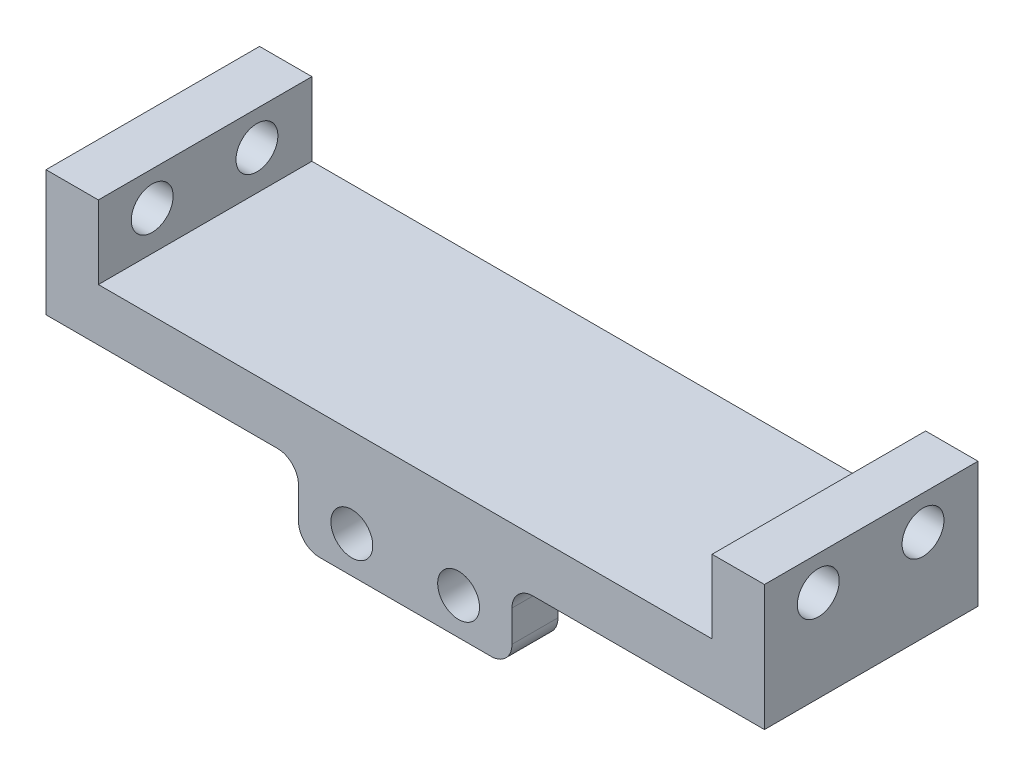
ISO-10303-21;
HEADER;
FILE_DESCRIPTION(('STEP AP214'),'2;1');
FILE_NAME('part.step','',(''),(''),'','','');
FILE_SCHEMA(('AUTOMOTIVE_DESIGN { 1 0 10303 214 1 1 1 1 }'));
ENDSEC;
DATA;
#1=APPLICATION_CONTEXT('core data for automotive mechanical design processes');
#2=APPLICATION_PROTOCOL_DEFINITION('international standard','automotive_design',2000,#1);
#3=PRODUCT_CONTEXT('',#1,'mechanical');
#4=PRODUCT('Part','Part','',(#3));
#5=PRODUCT_RELATED_PRODUCT_CATEGORY('part','',(#4));
#6=PRODUCT_DEFINITION_FORMATION('','',#4);
#7=PRODUCT_DEFINITION_CONTEXT('part definition',#1,'design');
#8=PRODUCT_DEFINITION('design','',#6,#7);
#9=PRODUCT_DEFINITION_SHAPE('','',#8);
#10=(LENGTH_UNIT() NAMED_UNIT(*) SI_UNIT(.MILLI.,.METRE.));
#11=(NAMED_UNIT(*) PLANE_ANGLE_UNIT() SI_UNIT($,.RADIAN.));
#12=(NAMED_UNIT(*) SI_UNIT($,.STERADIAN.) SOLID_ANGLE_UNIT());
#13=UNCERTAINTY_MEASURE_WITH_UNIT(LENGTH_MEASURE(1.E-05),#10,'distance_accuracy_value','');
#14=(GEOMETRIC_REPRESENTATION_CONTEXT(3) GLOBAL_UNCERTAINTY_ASSIGNED_CONTEXT((#13)) GLOBAL_UNIT_ASSIGNED_CONTEXT((#10,
#11,#12)) REPRESENTATION_CONTEXT('',''));
#15=CARTESIAN_POINT('',(0.,0.,0.));
#16=DIRECTION('',(0.,0.,1.));
#17=DIRECTION('',(1.,0.,0.));
#18=AXIS2_PLACEMENT_3D('',#15,#16,#17);
#19=CARTESIAN_POINT('',(0.,5.,0.));
#20=DIRECTION('',(1.,0.,0.));
#21=DIRECTION('',(0.,0.,-1.));
#22=AXIS2_PLACEMENT_3D('',#19,#20,#21);
#23=PLANE('',#22);
#24=CARTESIAN_POINT('',(0.,8.75,-15.13979341));
#25=DIRECTION('',(1.,0.,0.));
#26=DIRECTION('',(0.,0.,-1.));
#27=AXIS2_PLACEMENT_3D('',#24,#25,#26);
#28=CIRCLE('',#27,2.);
#29=CARTESIAN_POINT('',(0.,8.75,-17.13979341));
#30=VERTEX_POINT('',#29);
#31=EDGE_CURVE('E187',#30,#30,#28,.T.);
#32=ORIENTED_EDGE('',*,*,#31,.T.);
#33=EDGE_LOOP('',(#32));
#34=FACE_BOUND('',#33,.T.);
#35=CARTESIAN_POINT('',(0.,8.75,-5.13979341));
#36=DIRECTION('',(1.,0.,0.));
#37=DIRECTION('',(0.,0.,-1.));
#38=AXIS2_PLACEMENT_3D('',#35,#36,#37);
#39=CIRCLE('',#38,2.);
#40=CARTESIAN_POINT('',(0.,8.75,-7.13979341));
#41=VERTEX_POINT('',#40);
#42=EDGE_CURVE('E194',#41,#41,#39,.T.);
#43=ORIENTED_EDGE('',*,*,#42,.T.);
#44=EDGE_LOOP('',(#43));
#45=FACE_BOUND('',#44,.T.);
#46=DIRECTION('',(0.,0.,1.));
#47=VECTOR('',#46,1.);
#48=CARTESIAN_POINT('',(0.,0.,0.));
#49=LINE('',#48,#47);
#50=CARTESIAN_POINT('',(0.,0.,-20.38979341));
#51=VERTEX_POINT('',#50);
#52=CARTESIAN_POINT('',(0.,0.,0.));
#53=VERTEX_POINT('',#52);
#54=EDGE_CURVE('E216',#51,#53,#49,.T.);
#55=ORIENTED_EDGE('',*,*,#54,.T.);
#56=DIRECTION('',(0.,-1.,0.));
#57=VECTOR('',#56,1.);
#58=CARTESIAN_POINT('',(0.,5.,0.));
#59=LINE('',#58,#57);
#60=CARTESIAN_POINT('',(0.,12.,0.));
#61=VERTEX_POINT('',#60);
#62=EDGE_CURVE('E238',#61,#53,#59,.T.);
#63=ORIENTED_EDGE('',*,*,#62,.F.);
#64=DIRECTION('',(0.,0.,-1.));
#65=VECTOR('',#64,1.);
#66=CARTESIAN_POINT('',(0.,12.,-20.38979341));
#67=LINE('',#66,#65);
#68=CARTESIAN_POINT('',(0.,12.,-20.38979341));
#69=VERTEX_POINT('',#68);
#70=EDGE_CURVE('E190',#61,#69,#67,.T.);
#71=ORIENTED_EDGE('',*,*,#70,.T.);
#72=DIRECTION('',(0.,-1.,0.));
#73=VECTOR('',#72,1.);
#74=CARTESIAN_POINT('',(0.,5.,-20.38979341));
#75=LINE('',#74,#73);
#76=EDGE_CURVE('E221',#69,#51,#75,.T.);
#77=ORIENTED_EDGE('',*,*,#76,.T.);
#78=EDGE_LOOP('',(#55,#63,#71,#77));
#79=FACE_BOUND('',#78,.T.);
#80=ADVANCED_FACE('F39',(#34,#45,#79),#23,.F.);
#81=CARTESIAN_POINT('',(0.,5.,0.));
#82=DIRECTION('',(0.,0.,-1.));
#83=DIRECTION('',(-1.,0.,0.));
#84=AXIS2_PLACEMENT_3D('',#81,#82,#83);
#85=PLANE('',#84);
#86=CARTESIAN_POINT('',(39.3974483525,-3.49999999999999,0.));
#87=DIRECTION('',(0.,0.,1.));
#88=DIRECTION('',(1.,0.,0.));
#89=AXIS2_PLACEMENT_3D('',#86,#87,#88);
#90=CIRCLE('',#89,2.);
#91=CARTESIAN_POINT('',(41.3974483525,-3.49999999999999,0.));
#92=VERTEX_POINT('',#91);
#93=EDGE_CURVE('E246',#92,#92,#90,.T.);
#94=ORIENTED_EDGE('',*,*,#93,.F.);
#95=EDGE_LOOP('',(#94));
#96=FACE_BOUND('',#95,.T.);
#97=CARTESIAN_POINT('',(29.2025516475,-3.49999999999999,0.));
#98=DIRECTION('',(0.,0.,1.));
#99=DIRECTION('',(-1.,0.,0.));
#100=AXIS2_PLACEMENT_3D('',#97,#98,#99);
#101=CIRCLE('',#100,2.);
#102=CARTESIAN_POINT('',(27.2025516475,-3.49999999999999,0.));
#103=VERTEX_POINT('',#102);
#104=EDGE_CURVE('E374',#103,#103,#101,.T.);
#105=ORIENTED_EDGE('',*,*,#104,.F.);
#106=EDGE_LOOP('',(#105));
#107=FACE_BOUND('',#106,.T.);
#108=DIRECTION('',(0.,-1.,0.));
#109=VECTOR('',#108,1.);
#110=CARTESIAN_POINT('',(24.105103295,0.,0.));
#111=LINE('',#110,#109);
#112=CARTESIAN_POINT('',(24.105103295,-2.,0.));
#113=VERTEX_POINT('',#112);
#114=CARTESIAN_POINT('',(24.105103295,-5.,0.));
#115=VERTEX_POINT('',#114);
#116=EDGE_CURVE('E283',#113,#115,#111,.T.);
#117=ORIENTED_EDGE('',*,*,#116,.T.);
#118=CARTESIAN_POINT('',(26.105103295,-5.,0.));
#119=DIRECTION('',(0.,0.,-1.));
#120=DIRECTION('',(-1.,0.,0.));
#121=AXIS2_PLACEMENT_3D('',#118,#119,#120);
#122=CIRCLE('',#121,2.);
#123=CARTESIAN_POINT('',(26.105103295,-7.,0.));
#124=VERTEX_POINT('',#123);
#125=EDGE_CURVE('E256',#115,#124,#122,.F.);
#126=ORIENTED_EDGE('',*,*,#125,.T.);
#127=DIRECTION('',(1.,0.,0.));
#128=VECTOR('',#127,1.);
#129=CARTESIAN_POINT('',(44.494896705,-6.99999999999999,0.));
#130=LINE('',#129,#128);
#131=CARTESIAN_POINT('',(42.494896705,-6.99999999999999,0.));
#132=VERTEX_POINT('',#131);
#133=EDGE_CURVE('E292',#124,#132,#130,.T.);
#134=ORIENTED_EDGE('',*,*,#133,.T.);
#135=CARTESIAN_POINT('',(42.494896705,-4.99999999999999,0.));
#136=DIRECTION('',(0.,0.,-1.));
#137=DIRECTION('',(-1.,0.,0.));
#138=AXIS2_PLACEMENT_3D('',#135,#136,#137);
#139=CIRCLE('',#138,2.);
#140=CARTESIAN_POINT('',(44.494896705,-4.99999999999999,0.));
#141=VERTEX_POINT('',#140);
#142=EDGE_CURVE('E254',#132,#141,#139,.F.);
#143=ORIENTED_EDGE('',*,*,#142,.T.);
#144=DIRECTION('',(0.,1.,0.));
#145=VECTOR('',#144,1.);
#146=CARTESIAN_POINT('',(44.494896705,0.,0.));
#147=LINE('',#146,#145);
#148=CARTESIAN_POINT('',(44.494896705,-2.,0.));
#149=VERTEX_POINT('',#148);
#150=EDGE_CURVE('E249',#141,#149,#147,.T.);
#151=ORIENTED_EDGE('',*,*,#150,.T.);
#152=CARTESIAN_POINT('',(46.494896705,-2.,0.));
#153=DIRECTION('',(0.,0.,-1.));
#154=DIRECTION('',(-1.,0.,0.));
#155=AXIS2_PLACEMENT_3D('',#152,#153,#154);
#156=CIRCLE('',#155,2.);
#157=CARTESIAN_POINT('',(46.494896705,0.,0.));
#158=VERTEX_POINT('',#157);
#159=EDGE_CURVE('E276',#149,#158,#156,.T.);
#160=ORIENTED_EDGE('',*,*,#159,.T.);
#161=DIRECTION('',(1.,0.,0.));
#162=VECTOR('',#161,1.);
#163=CARTESIAN_POINT('',(0.,0.,0.));
#164=LINE('',#163,#162);
#165=CARTESIAN_POINT('',(68.6,0.,0.));
#166=VERTEX_POINT('',#165);
#167=EDGE_CURVE('E224',#158,#166,#164,.T.);
#168=ORIENTED_EDGE('',*,*,#167,.T.);
#169=DIRECTION('',(0.,-1.,0.));
#170=VECTOR('',#169,1.);
#171=CARTESIAN_POINT('',(68.6,5.,0.));
#172=LINE('',#171,#170);
#173=CARTESIAN_POINT('',(68.6,12.,0.));
#174=VERTEX_POINT('',#173);
#175=EDGE_CURVE('E235',#174,#166,#172,.T.);
#176=ORIENTED_EDGE('',*,*,#175,.F.);
#177=DIRECTION('',(1.,0.,0.));
#178=VECTOR('',#177,1.);
#179=CARTESIAN_POINT('',(63.6,12.,0.));
#180=LINE('',#179,#178);
#181=CARTESIAN_POINT('',(63.6,12.,0.));
#182=VERTEX_POINT('',#181);
#183=EDGE_CURVE('E169',#182,#174,#180,.T.);
#184=ORIENTED_EDGE('',*,*,#183,.F.);
#185=DIRECTION('',(0.,1.,0.));
#186=VECTOR('',#185,1.);
#187=CARTESIAN_POINT('',(63.6,0.,0.));
#188=LINE('',#187,#186);
#189=CARTESIAN_POINT('',(63.6,5.,0.));
#190=VERTEX_POINT('',#189);
#191=EDGE_CURVE('E156',#190,#182,#188,.T.);
#192=ORIENTED_EDGE('',*,*,#191,.F.);
#193=DIRECTION('',(1.,0.,0.));
#194=VECTOR('',#193,1.);
#195=CARTESIAN_POINT('',(0.,5.,0.));
#196=LINE('',#195,#194);
#197=CARTESIAN_POINT('',(5.,5.,0.));
#198=VERTEX_POINT('',#197);
#199=EDGE_CURVE('E217',#198,#190,#196,.T.);
#200=ORIENTED_EDGE('',*,*,#199,.F.);
#201=DIRECTION('',(0.,1.,0.));
#202=VECTOR('',#201,1.);
#203=CARTESIAN_POINT('',(5.,0.,0.));
#204=LINE('',#203,#202);
#205=CARTESIAN_POINT('',(5.,12.,0.));
#206=VERTEX_POINT('',#205);
#207=EDGE_CURVE('E201',#198,#206,#204,.T.);
#208=ORIENTED_EDGE('',*,*,#207,.T.);
#209=DIRECTION('',(-1.,0.,0.));
#210=VECTOR('',#209,1.);
#211=CARTESIAN_POINT('',(5.,12.,0.));
#212=LINE('',#211,#210);
#213=EDGE_CURVE('E206',#206,#61,#212,.T.);
#214=ORIENTED_EDGE('',*,*,#213,.T.);
#215=ORIENTED_EDGE('',*,*,#62,.T.);
#216=CARTESIAN_POINT('',(22.105103295,0.,0.));
#217=VERTEX_POINT('',#216);
#218=EDGE_CURVE('E225',#53,#217,#164,.T.);
#219=ORIENTED_EDGE('',*,*,#218,.T.);
#220=CARTESIAN_POINT('',(22.105103295,-2.,0.));
#221=DIRECTION('',(0.,0.,-1.));
#222=DIRECTION('',(-1.,0.,0.));
#223=AXIS2_PLACEMENT_3D('',#220,#221,#222);
#224=CIRCLE('',#223,2.);
#225=EDGE_CURVE('E47',#217,#113,#224,.T.);
#226=ORIENTED_EDGE('',*,*,#225,.T.);
#227=EDGE_LOOP('',(#117,#126,#134,#143,#151,#160,#168,#176,#184,#192,#200,#208,#214,#215,#219,#226));
#228=FACE_BOUND('',#227,.T.);
#229=ADVANCED_FACE('F282',(#96,#107,#228),#85,.F.);
#230=CARTESIAN_POINT('',(68.6,5.,0.));
#231=DIRECTION('',(-1.,0.,0.));
#232=DIRECTION('',(0.,0.,1.));
#233=AXIS2_PLACEMENT_3D('',#230,#231,#232);
#234=PLANE('',#233);
#235=CARTESIAN_POINT('',(68.6,8.75,-15.13979341));
#236=DIRECTION('',(1.,0.,0.));
#237=DIRECTION('',(0.,0.,-1.));
#238=AXIS2_PLACEMENT_3D('',#235,#236,#237);
#239=CIRCLE('',#238,2.);
#240=CARTESIAN_POINT('',(68.6,8.75,-17.13979341));
#241=VERTEX_POINT('',#240);
#242=EDGE_CURVE('E176',#241,#241,#239,.T.);
#243=ORIENTED_EDGE('',*,*,#242,.F.);
#244=EDGE_LOOP('',(#243));
#245=FACE_BOUND('',#244,.T.);
#246=CARTESIAN_POINT('',(68.6,8.75,-5.13979341));
#247=DIRECTION('',(1.,0.,0.));
#248=DIRECTION('',(0.,0.,-1.));
#249=AXIS2_PLACEMENT_3D('',#246,#247,#248);
#250=CIRCLE('',#249,2.);
#251=CARTESIAN_POINT('',(68.6,8.75,-7.13979341));
#252=VERTEX_POINT('',#251);
#253=EDGE_CURVE('E315',#252,#252,#250,.T.);
#254=ORIENTED_EDGE('',*,*,#253,.F.);
#255=EDGE_LOOP('',(#254));
#256=FACE_BOUND('',#255,.T.);
#257=DIRECTION('',(0.,0.,-1.));
#258=VECTOR('',#257,1.);
#259=CARTESIAN_POINT('',(68.6,0.,0.));
#260=LINE('',#259,#258);
#261=CARTESIAN_POINT('',(68.6,0.,-20.38979341));
#262=VERTEX_POINT('',#261);
#263=EDGE_CURVE('E228',#166,#262,#260,.T.);
#264=ORIENTED_EDGE('',*,*,#263,.T.);
#265=DIRECTION('',(0.,-1.,0.));
#266=VECTOR('',#265,1.);
#267=CARTESIAN_POINT('',(68.6,5.,-20.38979341));
#268=LINE('',#267,#266);
#269=CARTESIAN_POINT('',(68.6,12.,-20.38979341));
#270=VERTEX_POINT('',#269);
#271=EDGE_CURVE('E233',#270,#262,#268,.T.);
#272=ORIENTED_EDGE('',*,*,#271,.F.);
#273=DIRECTION('',(0.,0.,-1.));
#274=VECTOR('',#273,1.);
#275=CARTESIAN_POINT('',(68.6,12.,-20.38979341));
#276=LINE('',#275,#274);
#277=EDGE_CURVE('E166',#174,#270,#276,.T.);
#278=ORIENTED_EDGE('',*,*,#277,.F.);
#279=ORIENTED_EDGE('',*,*,#175,.T.);
#280=EDGE_LOOP('',(#264,#272,#278,#279));
#281=FACE_BOUND('',#280,.T.);
#282=ADVANCED_FACE('F344',(#245,#256,#281),#234,.F.);
#283=CARTESIAN_POINT('',(0.,5.,-20.38979341));
#284=DIRECTION('',(0.,0.,1.));
#285=DIRECTION('',(1.,0.,0.));
#286=AXIS2_PLACEMENT_3D('',#283,#284,#285);
#287=PLANE('',#286);
#288=DIRECTION('',(-1.,0.,0.));
#289=VECTOR('',#288,1.);
#290=CARTESIAN_POINT('',(0.,5.,-20.38979341));
#291=LINE('',#290,#289);
#292=CARTESIAN_POINT('',(63.6,5.,-20.38979341));
#293=VERTEX_POINT('',#292);
#294=CARTESIAN_POINT('',(5.,5.,-20.38979341));
#295=VERTEX_POINT('',#294);
#296=EDGE_CURVE('E174',#293,#295,#291,.T.);
#297=ORIENTED_EDGE('',*,*,#296,.F.);
#298=DIRECTION('',(0.,-1.,0.));
#299=VECTOR('',#298,1.);
#300=CARTESIAN_POINT('',(63.6,0.,-20.38979341));
#301=LINE('',#300,#299);
#302=CARTESIAN_POINT('',(63.6,12.,-20.38979341));
#303=VERTEX_POINT('',#302);
#304=EDGE_CURVE('E154',#303,#293,#301,.T.);
#305=ORIENTED_EDGE('',*,*,#304,.F.);
#306=DIRECTION('',(1.,0.,0.));
#307=VECTOR('',#306,1.);
#308=CARTESIAN_POINT('',(63.6,12.,-20.38979341));
#309=LINE('',#308,#307);
#310=EDGE_CURVE('E163',#303,#270,#309,.T.);
#311=ORIENTED_EDGE('',*,*,#310,.T.);
#312=ORIENTED_EDGE('',*,*,#271,.T.);
#313=DIRECTION('',(-1.,0.,0.));
#314=VECTOR('',#313,1.);
#315=CARTESIAN_POINT('',(0.,0.,-20.38979341));
#316=LINE('',#315,#314);
#317=EDGE_CURVE('E219',#262,#51,#316,.T.);
#318=ORIENTED_EDGE('',*,*,#317,.T.);
#319=ORIENTED_EDGE('',*,*,#76,.F.);
#320=DIRECTION('',(-1.,0.,0.));
#321=VECTOR('',#320,1.);
#322=CARTESIAN_POINT('',(5.,12.,-20.38979341));
#323=LINE('',#322,#321);
#324=CARTESIAN_POINT('',(5.,12.,-20.38979341));
#325=VERTEX_POINT('',#324);
#326=EDGE_CURVE('E209',#325,#69,#323,.T.);
#327=ORIENTED_EDGE('',*,*,#326,.F.);
#328=DIRECTION('',(0.,-1.,0.));
#329=VECTOR('',#328,1.);
#330=CARTESIAN_POINT('',(5.,0.,-20.38979341));
#331=LINE('',#330,#329);
#332=EDGE_CURVE('E199',#325,#295,#331,.T.);
#333=ORIENTED_EDGE('',*,*,#332,.T.);
#334=EDGE_LOOP('',(#297,#305,#311,#312,#318,#319,#327,#333));
#335=FACE_BOUND('',#334,.T.);
#336=ADVANCED_FACE('F172',(#335),#287,.F.);
#337=CARTESIAN_POINT('',(0.,5.,0.));
#338=DIRECTION('',(0.,-1.,0.));
#339=DIRECTION('',(0.,0.,-1.));
#340=AXIS2_PLACEMENT_3D('',#337,#338,#339);
#341=PLANE('',#340);
#342=ORIENTED_EDGE('',*,*,#199,.T.);
#343=DIRECTION('',(0.,0.,-1.));
#344=VECTOR('',#343,1.);
#345=CARTESIAN_POINT('',(63.6,5.,0.));
#346=LINE('',#345,#344);
#347=EDGE_CURVE('E183',#190,#293,#346,.T.);
#348=ORIENTED_EDGE('',*,*,#347,.T.);
#349=ORIENTED_EDGE('',*,*,#296,.T.);
#350=DIRECTION('',(0.,0.,1.));
#351=VECTOR('',#350,1.);
#352=CARTESIAN_POINT('',(5.,5.,0.));
#353=LINE('',#352,#351);
#354=EDGE_CURVE('E212',#295,#198,#353,.T.);
#355=ORIENTED_EDGE('',*,*,#354,.T.);
#356=EDGE_LOOP('',(#342,#348,#349,#355));
#357=FACE_BOUND('',#356,.T.);
#358=ADVANCED_FACE('F464',(#357),#341,.F.);
#359=CARTESIAN_POINT('',(0.,0.,0.));
#360=DIRECTION('',(0.,-1.,0.));
#361=DIRECTION('',(0.,0.,-1.));
#362=AXIS2_PLACEMENT_3D('',#359,#360,#361);
#363=PLANE('',#362);
#364=ORIENTED_EDGE('',*,*,#167,.F.);
#365=DIRECTION('',(0.,0.,1.));
#366=VECTOR('',#365,1.);
#367=CARTESIAN_POINT('',(46.494896705,0.,-4.38979341));
#368=LINE('',#367,#366);
#369=CARTESIAN_POINT('',(46.494896705,0.,-4.38979341));
#370=VERTEX_POINT('',#369);
#371=EDGE_CURVE('E274',#158,#370,#368,.F.);
#372=ORIENTED_EDGE('',*,*,#371,.T.);
#373=DIRECTION('',(-1.,0.,0.));
#374=VECTOR('',#373,1.);
#375=CARTESIAN_POINT('',(44.494896705,0.,-4.38979341));
#376=LINE('',#375,#374);
#377=CARTESIAN_POINT('',(22.105103295,0.,-4.38979341));
#378=VERTEX_POINT('',#377);
#379=EDGE_CURVE('E53',#370,#378,#376,.T.);
#380=ORIENTED_EDGE('',*,*,#379,.T.);
#381=DIRECTION('',(0.,0.,1.));
#382=VECTOR('',#381,1.);
#383=CARTESIAN_POINT('',(22.105103295,0.,0.));
#384=LINE('',#383,#382);
#385=EDGE_CURVE('E272',#378,#217,#384,.T.);
#386=ORIENTED_EDGE('',*,*,#385,.T.);
#387=ORIENTED_EDGE('',*,*,#218,.F.);
#388=ORIENTED_EDGE('',*,*,#54,.F.);
#389=ORIENTED_EDGE('',*,*,#317,.F.);
#390=ORIENTED_EDGE('',*,*,#263,.F.);
#391=EDGE_LOOP('',(#364,#372,#380,#386,#387,#388,#389,#390));
#392=FACE_BOUND('',#391,.T.);
#393=ADVANCED_FACE('F461',(#392),#363,.T.);
#394=CARTESIAN_POINT('',(5.,0.,0.));
#395=DIRECTION('',(1.,0.,0.));
#396=DIRECTION('',(0.,0.,-1.));
#397=AXIS2_PLACEMENT_3D('',#394,#395,#396);
#398=PLANE('',#397);
#399=CARTESIAN_POINT('',(5.,8.75,-15.13979341));
#400=DIRECTION('',(1.,0.,0.));
#401=DIRECTION('',(0.,0.,-1.));
#402=AXIS2_PLACEMENT_3D('',#399,#400,#401);
#403=CIRCLE('',#402,2.);
#404=CARTESIAN_POINT('',(5.,8.75,-17.13979341));
#405=VERTEX_POINT('',#404);
#406=EDGE_CURVE('E191',#405,#405,#403,.T.);
#407=ORIENTED_EDGE('',*,*,#406,.F.);
#408=EDGE_LOOP('',(#407));
#409=FACE_BOUND('',#408,.T.);
#410=CARTESIAN_POINT('',(5.,8.75,-5.13979341));
#411=DIRECTION('',(1.,0.,0.));
#412=DIRECTION('',(0.,0.,-1.));
#413=AXIS2_PLACEMENT_3D('',#410,#411,#412);
#414=CIRCLE('',#413,2.);
#415=CARTESIAN_POINT('',(5.,8.75,-7.13979341));
#416=VERTEX_POINT('',#415);
#417=EDGE_CURVE('E186',#416,#416,#414,.T.);
#418=ORIENTED_EDGE('',*,*,#417,.F.);
#419=EDGE_LOOP('',(#418));
#420=FACE_BOUND('',#419,.T.);
#421=ORIENTED_EDGE('',*,*,#354,.F.);
#422=ORIENTED_EDGE('',*,*,#332,.F.);
#423=DIRECTION('',(0.,0.,-1.));
#424=VECTOR('',#423,1.);
#425=CARTESIAN_POINT('',(5.,12.,-20.38979341));
#426=LINE('',#425,#424);
#427=EDGE_CURVE('E203',#206,#325,#426,.T.);
#428=ORIENTED_EDGE('',*,*,#427,.F.);
#429=ORIENTED_EDGE('',*,*,#207,.F.);
#430=EDGE_LOOP('',(#421,#422,#428,#429));
#431=FACE_BOUND('',#430,.T.);
#432=ADVANCED_FACE('F463',(#409,#420,#431),#398,.T.);
#433=CARTESIAN_POINT('',(5.,12.,-20.38979341));
#434=DIRECTION('',(0.,1.,0.));
#435=DIRECTION('',(0.,0.,1.));
#436=AXIS2_PLACEMENT_3D('',#433,#434,#435);
#437=PLANE('',#436);
#438=ORIENTED_EDGE('',*,*,#70,.F.);
#439=ORIENTED_EDGE('',*,*,#213,.F.);
#440=ORIENTED_EDGE('',*,*,#427,.T.);
#441=ORIENTED_EDGE('',*,*,#326,.T.);
#442=EDGE_LOOP('',(#438,#439,#440,#441));
#443=FACE_BOUND('',#442,.T.);
#444=ADVANCED_FACE('F528',(#443),#437,.T.);
#445=CARTESIAN_POINT('',(0.,8.75,-5.13979341));
#446=DIRECTION('',(1.,0.,0.));
#447=DIRECTION('',(0.,0.,-1.));
#448=AXIS2_PLACEMENT_3D('',#445,#446,#447);
#449=CYLINDRICAL_SURFACE('',#448,2.);
#450=ORIENTED_EDGE('',*,*,#42,.F.);
#451=EDGE_LOOP('',(#450));
#452=FACE_BOUND('',#451,.T.);
#453=ORIENTED_EDGE('',*,*,#417,.T.);
#454=EDGE_LOOP('',(#453));
#455=FACE_BOUND('',#454,.T.);
#456=ADVANCED_FACE('F520',(#452,#455),#449,.F.);
#457=CARTESIAN_POINT('',(0.,8.75,-15.13979341));
#458=DIRECTION('',(1.,0.,0.));
#459=DIRECTION('',(0.,0.,-1.));
#460=AXIS2_PLACEMENT_3D('',#457,#458,#459);
#461=CYLINDRICAL_SURFACE('',#460,2.);
#462=ORIENTED_EDGE('',*,*,#31,.F.);
#463=EDGE_LOOP('',(#462));
#464=FACE_BOUND('',#463,.T.);
#465=ORIENTED_EDGE('',*,*,#406,.T.);
#466=EDGE_LOOP('',(#465));
#467=FACE_BOUND('',#466,.T.);
#468=ADVANCED_FACE('F491',(#464,#467),#461,.F.);
#469=CARTESIAN_POINT('',(63.6,0.,0.));
#470=DIRECTION('',(-1.,0.,0.));
#471=DIRECTION('',(0.,0.,-1.));
#472=AXIS2_PLACEMENT_3D('',#469,#470,#471);
#473=PLANE('',#472);
#474=CARTESIAN_POINT('',(63.6,8.75,-15.13979341));
#475=DIRECTION('',(1.,0.,0.));
#476=DIRECTION('',(0.,0.,-1.));
#477=AXIS2_PLACEMENT_3D('',#474,#475,#476);
#478=CIRCLE('',#477,2.);
#479=CARTESIAN_POINT('',(63.6,8.75,-17.13979341));
#480=VERTEX_POINT('',#479);
#481=EDGE_CURVE('E313',#480,#480,#478,.T.);
#482=ORIENTED_EDGE('',*,*,#481,.T.);
#483=EDGE_LOOP('',(#482));
#484=FACE_BOUND('',#483,.T.);
#485=CARTESIAN_POINT('',(63.6,8.75,-5.13979341));
#486=DIRECTION('',(1.,0.,0.));
#487=DIRECTION('',(0.,0.,-1.));
#488=AXIS2_PLACEMENT_3D('',#485,#486,#487);
#489=CIRCLE('',#488,2.);
#490=CARTESIAN_POINT('',(63.6,8.75,-7.13979341));
#491=VERTEX_POINT('',#490);
#492=EDGE_CURVE('E179',#491,#491,#489,.T.);
#493=ORIENTED_EDGE('',*,*,#492,.T.);
#494=EDGE_LOOP('',(#493));
#495=FACE_BOUND('',#494,.T.);
#496=ORIENTED_EDGE('',*,*,#347,.F.);
#497=ORIENTED_EDGE('',*,*,#191,.T.);
#498=DIRECTION('',(0.,0.,-1.));
#499=VECTOR('',#498,1.);
#500=CARTESIAN_POINT('',(63.6,12.,-20.38979341));
#501=LINE('',#500,#499);
#502=EDGE_CURVE('E149',#182,#303,#501,.T.);
#503=ORIENTED_EDGE('',*,*,#502,.T.);
#504=ORIENTED_EDGE('',*,*,#304,.T.);
#505=EDGE_LOOP('',(#496,#497,#503,#504));
#506=FACE_BOUND('',#505,.T.);
#507=ADVANCED_FACE('F152',(#484,#495,#506),#473,.T.);
#508=CARTESIAN_POINT('',(63.6,12.,-20.38979341));
#509=DIRECTION('',(0.,-1.,0.));
#510=DIRECTION('',(0.,0.,-1.));
#511=AXIS2_PLACEMENT_3D('',#508,#509,#510);
#512=PLANE('',#511);
#513=ORIENTED_EDGE('',*,*,#277,.T.);
#514=ORIENTED_EDGE('',*,*,#310,.F.);
#515=ORIENTED_EDGE('',*,*,#502,.F.);
#516=ORIENTED_EDGE('',*,*,#183,.T.);
#517=EDGE_LOOP('',(#513,#514,#515,#516));
#518=FACE_BOUND('',#517,.T.);
#519=ADVANCED_FACE('F164',(#518),#512,.F.);
#520=CARTESIAN_POINT('',(68.6,8.75,-5.13979341));
#521=DIRECTION('',(-1.,0.,0.));
#522=DIRECTION('',(0.,0.,1.));
#523=AXIS2_PLACEMENT_3D('',#520,#521,#522);
#524=CYLINDRICAL_SURFACE('',#523,2.);
#525=ORIENTED_EDGE('',*,*,#253,.T.);
#526=EDGE_LOOP('',(#525));
#527=FACE_BOUND('',#526,.T.);
#528=ORIENTED_EDGE('',*,*,#492,.F.);
#529=EDGE_LOOP('',(#528));
#530=FACE_BOUND('',#529,.T.);
#531=ADVANCED_FACE('F323',(#527,#530),#524,.F.);
#532=CARTESIAN_POINT('',(68.6,8.75,-15.13979341));
#533=DIRECTION('',(-1.,0.,0.));
#534=DIRECTION('',(0.,0.,1.));
#535=AXIS2_PLACEMENT_3D('',#532,#533,#534);
#536=CYLINDRICAL_SURFACE('',#535,2.);
#537=ORIENTED_EDGE('',*,*,#242,.T.);
#538=EDGE_LOOP('',(#537));
#539=FACE_BOUND('',#538,.T.);
#540=ORIENTED_EDGE('',*,*,#481,.F.);
#541=EDGE_LOOP('',(#540));
#542=FACE_BOUND('',#541,.T.);
#543=ADVANCED_FACE('F325',(#539,#542),#536,.F.);
#544=CARTESIAN_POINT('',(44.494896705,0.,-4.38979341));
#545=DIRECTION('',(1.,0.,0.));
#546=DIRECTION('',(0.,0.,-1.));
#547=AXIS2_PLACEMENT_3D('',#544,#545,#546);
#548=PLANE('',#547);
#549=ORIENTED_EDGE('',*,*,#150,.F.);
#550=DIRECTION('',(0.,0.,1.));
#551=VECTOR('',#550,1.);
#552=CARTESIAN_POINT('',(44.494896705,-4.99999999999999,-4.38979341));
#553=LINE('',#552,#551);
#554=CARTESIAN_POINT('',(44.494896705,-4.99999999999999,-4.38979341));
#555=VERTEX_POINT('',#554);
#556=EDGE_CURVE('E270',#141,#555,#553,.F.);
#557=ORIENTED_EDGE('',*,*,#556,.T.);
#558=DIRECTION('',(0.,1.,0.));
#559=VECTOR('',#558,1.);
#560=CARTESIAN_POINT('',(44.494896705,0.,-4.38979341));
#561=LINE('',#560,#559);
#562=CARTESIAN_POINT('',(44.494896705,-2.,-4.38979341));
#563=VERTEX_POINT('',#562);
#564=EDGE_CURVE('E303',#555,#563,#561,.T.);
#565=ORIENTED_EDGE('',*,*,#564,.T.);
#566=DIRECTION('',(0.,0.,1.));
#567=VECTOR('',#566,1.);
#568=CARTESIAN_POINT('',(44.494896705,-2.,0.));
#569=LINE('',#568,#567);
#570=EDGE_CURVE('E267',#563,#149,#569,.T.);
#571=ORIENTED_EDGE('',*,*,#570,.T.);
#572=EDGE_LOOP('',(#549,#557,#565,#571));
#573=FACE_BOUND('',#572,.T.);
#574=ADVANCED_FACE('F331',(#573),#548,.T.);
#575=CARTESIAN_POINT('',(44.494896705,-6.99999999999999,-4.38979341));
#576=DIRECTION('',(0.,-1.,0.));
#577=DIRECTION('',(1.,0.,0.));
#578=AXIS2_PLACEMENT_3D('',#575,#576,#577);
#579=PLANE('',#578);
#580=ORIENTED_EDGE('',*,*,#133,.F.);
#581=DIRECTION('',(0.,0.,1.));
#582=VECTOR('',#581,1.);
#583=CARTESIAN_POINT('',(26.105103295,-7.,-4.38979341));
#584=LINE('',#583,#582);
#585=CARTESIAN_POINT('',(26.105103295,-7.,-4.38979341));
#586=VERTEX_POINT('',#585);
#587=EDGE_CURVE('E261',#124,#586,#584,.F.);
#588=ORIENTED_EDGE('',*,*,#587,.T.);
#589=DIRECTION('',(1.,0.,0.));
#590=VECTOR('',#589,1.);
#591=CARTESIAN_POINT('',(44.494896705,-6.99999999999999,-4.38979341));
#592=LINE('',#591,#590);
#593=CARTESIAN_POINT('',(42.494896705,-6.99999999999999,-4.38979341));
#594=VERTEX_POINT('',#593);
#595=EDGE_CURVE('E299',#586,#594,#592,.T.);
#596=ORIENTED_EDGE('',*,*,#595,.T.);
#597=DIRECTION('',(0.,0.,1.));
#598=VECTOR('',#597,1.);
#599=CARTESIAN_POINT('',(42.494896705,-6.99999999999999,-4.38979341));
#600=LINE('',#599,#598);
#601=EDGE_CURVE('E258',#594,#132,#600,.T.);
#602=ORIENTED_EDGE('',*,*,#601,.T.);
#603=EDGE_LOOP('',(#580,#588,#596,#602));
#604=FACE_BOUND('',#603,.T.);
#605=ADVANCED_FACE('F396',(#604),#579,.T.);
#606=CARTESIAN_POINT('',(24.105103295,0.,-4.38979341));
#607=DIRECTION('',(-1.,0.,0.));
#608=DIRECTION('',(0.,-1.,0.));
#609=AXIS2_PLACEMENT_3D('',#606,#607,#608);
#610=PLANE('',#609);
#611=DIRECTION('',(0.,-1.,0.));
#612=VECTOR('',#611,1.);
#613=CARTESIAN_POINT('',(24.105103295,0.,-4.38979341));
#614=LINE('',#613,#612);
#615=CARTESIAN_POINT('',(24.105103295,-2.,-4.38979341));
#616=VERTEX_POINT('',#615);
#617=CARTESIAN_POINT('',(24.105103295,-5.,-4.38979341));
#618=VERTEX_POINT('',#617);
#619=EDGE_CURVE('E297',#616,#618,#614,.T.);
#620=ORIENTED_EDGE('',*,*,#619,.T.);
#621=DIRECTION('',(0.,0.,1.));
#622=VECTOR('',#621,1.);
#623=CARTESIAN_POINT('',(24.105103295,-5.,-4.38979341));
#624=LINE('',#623,#622);
#625=EDGE_CURVE('E251',#618,#115,#624,.T.);
#626=ORIENTED_EDGE('',*,*,#625,.T.);
#627=ORIENTED_EDGE('',*,*,#116,.F.);
#628=DIRECTION('',(0.,0.,1.));
#629=VECTOR('',#628,1.);
#630=CARTESIAN_POINT('',(24.105103295,-2.,-4.38979341));
#631=LINE('',#630,#629);
#632=EDGE_CURVE('E241',#113,#616,#631,.F.);
#633=ORIENTED_EDGE('',*,*,#632,.T.);
#634=EDGE_LOOP('',(#620,#626,#627,#633));
#635=FACE_BOUND('',#634,.T.);
#636=ADVANCED_FACE('F289',(#635),#610,.T.);
#637=CARTESIAN_POINT('',(0.,0.,-4.38979341));
#638=DIRECTION('',(0.,0.,-1.));
#639=DIRECTION('',(-1.,0.,0.));
#640=AXIS2_PLACEMENT_3D('',#637,#638,#639);
#641=PLANE('',#640);
#642=CARTESIAN_POINT('',(39.3974483525,-3.49999999999999,-4.38979341));
#643=DIRECTION('',(0.,0.,-1.));
#644=DIRECTION('',(-1.,0.,0.));
#645=AXIS2_PLACEMENT_3D('',#642,#643,#644);
#646=CIRCLE('',#645,2.);
#647=CARTESIAN_POINT('',(37.3974483525,-3.49999999999999,-4.38979341));
#648=VERTEX_POINT('',#647);
#649=EDGE_CURVE('E245',#648,#648,#646,.T.);
#650=ORIENTED_EDGE('',*,*,#649,.F.);
#651=EDGE_LOOP('',(#650));
#652=FACE_BOUND('',#651,.T.);
#653=CARTESIAN_POINT('',(29.2025516475,-3.49999999999999,-4.38979341));
#654=DIRECTION('',(0.,0.,-1.));
#655=DIRECTION('',(-1.,0.,0.));
#656=AXIS2_PLACEMENT_3D('',#653,#654,#655);
#657=CIRCLE('',#656,2.);
#658=CARTESIAN_POINT('',(27.2025516475,-3.49999999999999,-4.38979341));
#659=VERTEX_POINT('',#658);
#660=EDGE_CURVE('E242',#659,#659,#657,.T.);
#661=ORIENTED_EDGE('',*,*,#660,.F.);
#662=EDGE_LOOP('',(#661));
#663=FACE_BOUND('',#662,.T.);
#664=ORIENTED_EDGE('',*,*,#595,.F.);
#665=CARTESIAN_POINT('',(26.105103295,-5.,-4.38979341));
#666=DIRECTION('',(0.,0.,-1.));
#667=DIRECTION('',(-1.,0.,0.));
#668=AXIS2_PLACEMENT_3D('',#665,#666,#667);
#669=CIRCLE('',#668,2.);
#670=EDGE_CURVE('E265',#586,#618,#669,.T.);
#671=ORIENTED_EDGE('',*,*,#670,.T.);
#672=ORIENTED_EDGE('',*,*,#619,.F.);
#673=CARTESIAN_POINT('',(22.105103295,-2.,-4.38979341));
#674=DIRECTION('',(0.,0.,-1.));
#675=DIRECTION('',(-1.,0.,0.));
#676=AXIS2_PLACEMENT_3D('',#673,#674,#675);
#677=CIRCLE('',#676,2.);
#678=EDGE_CURVE('E11',#616,#378,#677,.F.);
#679=ORIENTED_EDGE('',*,*,#678,.T.);
#680=ORIENTED_EDGE('',*,*,#379,.F.);
#681=CARTESIAN_POINT('',(46.494896705,-2.,-4.38979341));
#682=DIRECTION('',(0.,0.,-1.));
#683=DIRECTION('',(-1.,0.,0.));
#684=AXIS2_PLACEMENT_3D('',#681,#682,#683);
#685=CIRCLE('',#684,2.);
#686=EDGE_CURVE('E278',#370,#563,#685,.F.);
#687=ORIENTED_EDGE('',*,*,#686,.T.);
#688=ORIENTED_EDGE('',*,*,#564,.F.);
#689=CARTESIAN_POINT('',(42.494896705,-4.99999999999999,-4.38979341));
#690=DIRECTION('',(0.,0.,-1.));
#691=DIRECTION('',(-1.,0.,0.));
#692=AXIS2_PLACEMENT_3D('',#689,#690,#691);
#693=CIRCLE('',#692,2.);
#694=EDGE_CURVE('E263',#555,#594,#693,.T.);
#695=ORIENTED_EDGE('',*,*,#694,.T.);
#696=EDGE_LOOP('',(#664,#671,#672,#679,#680,#687,#688,#695));
#697=FACE_BOUND('',#696,.T.);
#698=ADVANCED_FACE('F296',(#652,#663,#697),#641,.T.);
#699=CARTESIAN_POINT('',(29.2025516475,-3.49999999999999,-5.));
#700=DIRECTION('',(0.,0.,1.));
#701=DIRECTION('',(1.,0.,0.));
#702=AXIS2_PLACEMENT_3D('',#699,#700,#701);
#703=CYLINDRICAL_SURFACE('',#702,2.);
#704=ORIENTED_EDGE('',*,*,#660,.T.);
#705=EDGE_LOOP('',(#704));
#706=FACE_BOUND('',#705,.T.);
#707=ORIENTED_EDGE('',*,*,#104,.T.);
#708=EDGE_LOOP('',(#707));
#709=FACE_BOUND('',#708,.T.);
#710=ADVANCED_FACE('F383',(#706,#709),#703,.F.);
#711=CARTESIAN_POINT('',(39.3974483525,-3.49999999999999,-5.));
#712=DIRECTION('',(0.,0.,1.));
#713=DIRECTION('',(1.,0.,0.));
#714=AXIS2_PLACEMENT_3D('',#711,#712,#713);
#715=CYLINDRICAL_SURFACE('',#714,2.);
#716=ORIENTED_EDGE('',*,*,#649,.T.);
#717=EDGE_LOOP('',(#716));
#718=FACE_BOUND('',#717,.T.);
#719=ORIENTED_EDGE('',*,*,#93,.T.);
#720=EDGE_LOOP('',(#719));
#721=FACE_BOUND('',#720,.T.);
#722=ADVANCED_FACE('F354',(#718,#721),#715,.F.);
#723=CARTESIAN_POINT('',(26.105103295,-5.,-4.38979341));
#724=DIRECTION('',(0.,0.,1.));
#725=DIRECTION('',(1.,0.,0.));
#726=AXIS2_PLACEMENT_3D('',#723,#724,#725);
#727=CYLINDRICAL_SURFACE('',#726,2.);
#728=ORIENTED_EDGE('',*,*,#670,.F.);
#729=ORIENTED_EDGE('',*,*,#587,.F.);
#730=ORIENTED_EDGE('',*,*,#125,.F.);
#731=ORIENTED_EDGE('',*,*,#625,.F.);
#732=EDGE_LOOP('',(#728,#729,#730,#731));
#733=FACE_BOUND('',#732,.T.);
#734=ADVANCED_FACE('F350',(#733),#727,.T.);
#735=CARTESIAN_POINT('',(42.494896705,-4.99999999999999,-4.38979341));
#736=DIRECTION('',(0.,0.,1.));
#737=DIRECTION('',(1.,0.,0.));
#738=AXIS2_PLACEMENT_3D('',#735,#736,#737);
#739=CYLINDRICAL_SURFACE('',#738,2.);
#740=ORIENTED_EDGE('',*,*,#694,.F.);
#741=ORIENTED_EDGE('',*,*,#556,.F.);
#742=ORIENTED_EDGE('',*,*,#142,.F.);
#743=ORIENTED_EDGE('',*,*,#601,.F.);
#744=EDGE_LOOP('',(#740,#741,#742,#743));
#745=FACE_BOUND('',#744,.T.);
#746=ADVANCED_FACE('F353',(#745),#739,.T.);
#747=CARTESIAN_POINT('',(46.494896705,-2.,-4.38979341));
#748=DIRECTION('',(0.,0.,-1.));
#749=DIRECTION('',(-1.,0.,0.));
#750=AXIS2_PLACEMENT_3D('',#747,#748,#749);
#751=CYLINDRICAL_SURFACE('',#750,2.);
#752=ORIENTED_EDGE('',*,*,#686,.F.);
#753=ORIENTED_EDGE('',*,*,#371,.F.);
#754=ORIENTED_EDGE('',*,*,#159,.F.);
#755=ORIENTED_EDGE('',*,*,#570,.F.);
#756=EDGE_LOOP('',(#752,#753,#754,#755));
#757=FACE_BOUND('',#756,.T.);
#758=ADVANCED_FACE('F357',(#757),#751,.F.);
#759=CARTESIAN_POINT('',(22.105103295,-2.,0.));
#760=DIRECTION('',(0.,0.,-1.));
#761=DIRECTION('',(-1.,0.,0.));
#762=AXIS2_PLACEMENT_3D('',#759,#760,#761);
#763=CYLINDRICAL_SURFACE('',#762,2.);
#764=ORIENTED_EDGE('',*,*,#678,.F.);
#765=ORIENTED_EDGE('',*,*,#632,.F.);
#766=ORIENTED_EDGE('',*,*,#225,.F.);
#767=ORIENTED_EDGE('',*,*,#385,.F.);
#768=EDGE_LOOP('',(#764,#765,#766,#767));
#769=FACE_BOUND('',#768,.T.);
#770=ADVANCED_FACE('F41',(#769),#763,.F.);
#771=CLOSED_SHELL('',(#80,#229,#282,#336,#358,#393,#432,#444,#456,#468,#507,#519,#531,#543,#574,
#605,#636,#698,#710,#722,#734,#746,#758,#770));
#772=MANIFOLD_SOLID_BREP('B2',#771);
#773=ADVANCED_BREP_SHAPE_REPRESENTATION('',(#18,#772),#14);
#774=SHAPE_DEFINITION_REPRESENTATION(#9,#773);
ENDSEC;
END-ISO-10303-21;
